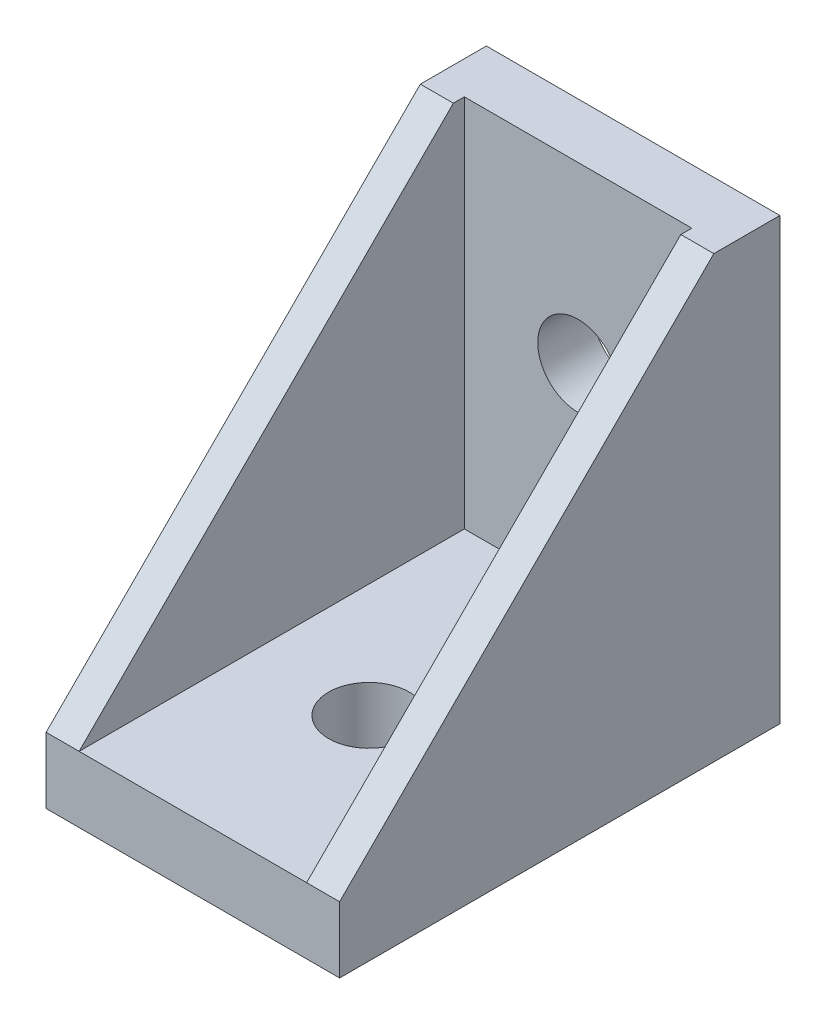
ISO-10303-21;
HEADER;
FILE_DESCRIPTION(('STEP AP214'),'2;1');
FILE_NAME('part.step','',(''),(''),'','','');
FILE_SCHEMA(('AUTOMOTIVE_DESIGN { 1 0 10303 214 1 1 1 1 }'));
ENDSEC;
DATA;
#1=APPLICATION_CONTEXT('core data for automotive mechanical design processes');
#2=APPLICATION_PROTOCOL_DEFINITION('international standard','automotive_design',2000,#1);
#3=PRODUCT_CONTEXT('',#1,'mechanical');
#4=PRODUCT('Part','Part','',(#3));
#5=PRODUCT_RELATED_PRODUCT_CATEGORY('part','',(#4));
#6=PRODUCT_DEFINITION_FORMATION('','',#4);
#7=PRODUCT_DEFINITION_CONTEXT('part definition',#1,'design');
#8=PRODUCT_DEFINITION('design','',#6,#7);
#9=PRODUCT_DEFINITION_SHAPE('','',#8);
#10=(LENGTH_UNIT() NAMED_UNIT(*) SI_UNIT(.MILLI.,.METRE.));
#11=(NAMED_UNIT(*) PLANE_ANGLE_UNIT() SI_UNIT($,.RADIAN.));
#12=(NAMED_UNIT(*) SI_UNIT($,.STERADIAN.) SOLID_ANGLE_UNIT());
#13=UNCERTAINTY_MEASURE_WITH_UNIT(LENGTH_MEASURE(1.E-05),#10,'distance_accuracy_value','');
#14=(GEOMETRIC_REPRESENTATION_CONTEXT(3) GLOBAL_UNCERTAINTY_ASSIGNED_CONTEXT((#13)) GLOBAL_UNIT_ASSIGNED_CONTEXT((#10,
#11,#12)) REPRESENTATION_CONTEXT('',''));
#15=CARTESIAN_POINT('',(0.,0.,0.));
#16=DIRECTION('',(0.,0.,1.));
#17=DIRECTION('',(1.,0.,0.));
#18=AXIS2_PLACEMENT_3D('',#15,#16,#17);
#19=CARTESIAN_POINT('',(10.,30.,-15.));
#20=DIRECTION('',(0.,-1.,0.));
#21=DIRECTION('',(0.,0.,-1.));
#22=AXIS2_PLACEMENT_3D('',#19,#20,#21);
#23=PLANE('',#22);
#24=DIRECTION('',(0.,0.,1.));
#25=VECTOR('',#24,1.);
#26=CARTESIAN_POINT('',(-7.75,30.,-11.25));
#27=LINE('',#26,#25);
#28=CARTESIAN_POINT('',(-7.75,30.,-11.25));
#29=VERTEX_POINT('',#28);
#30=CARTESIAN_POINT('',(-7.75,30.,-10.5));
#31=VERTEX_POINT('',#30);
#32=EDGE_CURVE('E225',#29,#31,#27,.T.);
#33=ORIENTED_EDGE('',*,*,#32,.F.);
#34=DIRECTION('',(1.,0.,0.));
#35=VECTOR('',#34,1.);
#36=CARTESIAN_POINT('',(-7.75,30.,-11.25));
#37=LINE('',#36,#35);
#38=CARTESIAN_POINT('',(7.75,30.,-11.25));
#39=VERTEX_POINT('',#38);
#40=EDGE_CURVE('E196',#29,#39,#37,.T.);
#41=ORIENTED_EDGE('',*,*,#40,.T.);
#42=DIRECTION('',(0.,0.,1.));
#43=VECTOR('',#42,1.);
#44=CARTESIAN_POINT('',(7.75,30.,-11.25));
#45=LINE('',#44,#43);
#46=CARTESIAN_POINT('',(7.75,30.,-10.5));
#47=VERTEX_POINT('',#46);
#48=EDGE_CURVE('E218',#39,#47,#45,.T.);
#49=ORIENTED_EDGE('',*,*,#48,.T.);
#50=DIRECTION('',(-1.,0.,0.));
#51=VECTOR('',#50,1.);
#52=CARTESIAN_POINT('',(10.,30.,-10.5));
#53=LINE('',#52,#51);
#54=CARTESIAN_POINT('',(10.,30.,-10.5));
#55=VERTEX_POINT('',#54);
#56=EDGE_CURVE('E50',#55,#47,#53,.T.);
#57=ORIENTED_EDGE('',*,*,#56,.F.);
#58=DIRECTION('',(0.,0.,1.));
#59=VECTOR('',#58,1.);
#60=CARTESIAN_POINT('',(10.,30.,-15.));
#61=LINE('',#60,#59);
#62=CARTESIAN_POINT('',(10.,30.,-15.));
#63=VERTEX_POINT('',#62);
#64=EDGE_CURVE('E108',#63,#55,#61,.T.);
#65=ORIENTED_EDGE('',*,*,#64,.F.);
#66=DIRECTION('',(-1.,0.,0.));
#67=VECTOR('',#66,1.);
#68=CARTESIAN_POINT('',(10.,30.,-15.));
#69=LINE('',#68,#67);
#70=CARTESIAN_POINT('',(-10.,30.,-15.));
#71=VERTEX_POINT('',#70);
#72=EDGE_CURVE('E11',#63,#71,#69,.T.);
#73=ORIENTED_EDGE('',*,*,#72,.T.);
#74=DIRECTION('',(0.,0.,1.));
#75=VECTOR('',#74,1.);
#76=CARTESIAN_POINT('',(-10.,30.,-15.));
#77=LINE('',#76,#75);
#78=CARTESIAN_POINT('',(-10.,30.,-10.5));
#79=VERTEX_POINT('',#78);
#80=EDGE_CURVE('E154',#71,#79,#77,.T.);
#81=ORIENTED_EDGE('',*,*,#80,.T.);
#82=EDGE_CURVE('E137',#31,#79,#53,.T.);
#83=ORIENTED_EDGE('',*,*,#82,.F.);
#84=EDGE_LOOP('',(#33,#41,#49,#57,#65,#73,#81,#83));
#85=FACE_BOUND('',#84,.T.);
#86=ADVANCED_FACE('F41',(#85),#23,.F.);
#87=CARTESIAN_POINT('',(10.,4.5,15.));
#88=DIRECTION('',(0.,-0.707106781186547,-0.707106781186548));
#89=DIRECTION('',(0.,0.707106781186548,-0.707106781186547));
#90=AXIS2_PLACEMENT_3D('',#87,#88,#89);
#91=PLANE('',#90);
#92=DIRECTION('',(0.,-0.707106781186548,0.707106781186547));
#93=VECTOR('',#92,1.);
#94=CARTESIAN_POINT('',(-7.75,30.,-10.5));
#95=LINE('',#94,#93);
#96=CARTESIAN_POINT('',(-7.75,4.5,15.));
#97=VERTEX_POINT('',#96);
#98=EDGE_CURVE('E60',#31,#97,#95,.T.);
#99=ORIENTED_EDGE('',*,*,#98,.F.);
#100=ORIENTED_EDGE('',*,*,#82,.T.);
#101=DIRECTION('',(0.,-0.707106781186548,0.707106781186547));
#102=VECTOR('',#101,1.);
#103=CARTESIAN_POINT('',(-10.,4.5,15.));
#104=LINE('',#103,#102);
#105=CARTESIAN_POINT('',(-10.,4.5,15.));
#106=VERTEX_POINT('',#105);
#107=EDGE_CURVE('E159',#79,#106,#104,.T.);
#108=ORIENTED_EDGE('',*,*,#107,.T.);
#109=DIRECTION('',(-1.,0.,0.));
#110=VECTOR('',#109,1.);
#111=CARTESIAN_POINT('',(10.,4.5,15.));
#112=LINE('',#111,#110);
#113=EDGE_CURVE('E138',#97,#106,#112,.T.);
#114=ORIENTED_EDGE('',*,*,#113,.F.);
#115=EDGE_LOOP('',(#99,#100,#108,#114));
#116=FACE_BOUND('',#115,.T.);
#117=ADVANCED_FACE('F178',(#116),#91,.F.);
#118=CARTESIAN_POINT('',(10.,0.,-15.));
#119=DIRECTION('',(0.,0.,1.));
#120=DIRECTION('',(0.,-1.,0.));
#121=AXIS2_PLACEMENT_3D('',#118,#119,#120);
#122=PLANE('',#121);
#123=CARTESIAN_POINT('',(0.,18.,-15.));
#124=DIRECTION('',(0.,0.,1.));
#125=DIRECTION('',(0.,-1.,0.));
#126=AXIS2_PLACEMENT_3D('',#123,#124,#125);
#127=CIRCLE('',#126,2.75);
#128=CARTESIAN_POINT('',(0.,15.25,-15.));
#129=VERTEX_POINT('',#128);
#130=EDGE_CURVE('E221',#129,#129,#127,.T.);
#131=ORIENTED_EDGE('',*,*,#130,.T.);
#132=EDGE_LOOP('',(#131));
#133=FACE_BOUND('',#132,.T.);
#134=DIRECTION('',(0.,1.,0.));
#135=VECTOR('',#134,1.);
#136=CARTESIAN_POINT('',(-10.,0.,-15.));
#137=LINE('',#136,#135);
#138=CARTESIAN_POINT('',(-10.,0.,-15.));
#139=VERTEX_POINT('',#138);
#140=EDGE_CURVE('E150',#139,#71,#137,.T.);
#141=ORIENTED_EDGE('',*,*,#140,.T.);
#142=ORIENTED_EDGE('',*,*,#72,.F.);
#143=DIRECTION('',(0.,1.,0.));
#144=VECTOR('',#143,1.);
#145=CARTESIAN_POINT('',(10.,0.,-15.));
#146=LINE('',#145,#144);
#147=CARTESIAN_POINT('',(10.,0.,-15.));
#148=VERTEX_POINT('',#147);
#149=EDGE_CURVE('E168',#148,#63,#146,.T.);
#150=ORIENTED_EDGE('',*,*,#149,.F.);
#151=DIRECTION('',(-1.,0.,0.));
#152=VECTOR('',#151,1.);
#153=CARTESIAN_POINT('',(10.,0.,-15.));
#154=LINE('',#153,#152);
#155=EDGE_CURVE('E146',#148,#139,#154,.T.);
#156=ORIENTED_EDGE('',*,*,#155,.T.);
#157=EDGE_LOOP('',(#141,#142,#150,#156));
#158=FACE_BOUND('',#157,.T.);
#159=ADVANCED_FACE('F43',(#133,#158),#122,.F.);
#160=ORIENTED_EDGE('',*,*,#56,.T.);
#161=DIRECTION('',(0.,-0.707106781186548,0.707106781186547));
#162=VECTOR('',#161,1.);
#163=CARTESIAN_POINT('',(7.75,30.,-10.5));
#164=LINE('',#163,#162);
#165=CARTESIAN_POINT('',(7.75,4.5,15.));
#166=VERTEX_POINT('',#165);
#167=EDGE_CURVE('E133',#47,#166,#164,.T.);
#168=ORIENTED_EDGE('',*,*,#167,.T.);
#169=CARTESIAN_POINT('',(10.,4.5,15.));
#170=VERTEX_POINT('',#169);
#171=EDGE_CURVE('E129',#170,#166,#112,.T.);
#172=ORIENTED_EDGE('',*,*,#171,.F.);
#173=DIRECTION('',(0.,-0.707106781186548,0.707106781186547));
#174=VECTOR('',#173,1.);
#175=CARTESIAN_POINT('',(10.,4.5,15.));
#176=LINE('',#175,#174);
#177=EDGE_CURVE('E117',#55,#170,#176,.T.);
#178=ORIENTED_EDGE('',*,*,#177,.F.);
#179=EDGE_LOOP('',(#160,#168,#172,#178));
#180=FACE_BOUND('',#179,.T.);
#181=ADVANCED_FACE('F130',(#180),#91,.F.);
#182=CARTESIAN_POINT('',(10.,0.,15.));
#183=DIRECTION('',(0.,0.,-1.));
#184=DIRECTION('',(0.,1.,0.));
#185=AXIS2_PLACEMENT_3D('',#182,#183,#184);
#186=PLANE('',#185);
#187=DIRECTION('',(0.,-1.,0.));
#188=VECTOR('',#187,1.);
#189=CARTESIAN_POINT('',(-10.,0.,15.));
#190=LINE('',#189,#188);
#191=CARTESIAN_POINT('',(-10.,0.,15.));
#192=VERTEX_POINT('',#191);
#193=EDGE_CURVE('E163',#106,#192,#190,.T.);
#194=ORIENTED_EDGE('',*,*,#193,.T.);
#195=DIRECTION('',(-1.,0.,0.));
#196=VECTOR('',#195,1.);
#197=CARTESIAN_POINT('',(10.,0.,15.));
#198=LINE('',#197,#196);
#199=CARTESIAN_POINT('',(10.,0.,15.));
#200=VERTEX_POINT('',#199);
#201=EDGE_CURVE('E141',#200,#192,#198,.T.);
#202=ORIENTED_EDGE('',*,*,#201,.F.);
#203=DIRECTION('',(0.,-1.,0.));
#204=VECTOR('',#203,1.);
#205=CARTESIAN_POINT('',(10.,0.,15.));
#206=LINE('',#205,#204);
#207=EDGE_CURVE('E121',#170,#200,#206,.T.);
#208=ORIENTED_EDGE('',*,*,#207,.F.);
#209=ORIENTED_EDGE('',*,*,#171,.T.);
#210=DIRECTION('',(1.,0.,0.));
#211=VECTOR('',#210,1.);
#212=CARTESIAN_POINT('',(-7.75,4.5,15.));
#213=LINE('',#212,#211);
#214=EDGE_CURVE('E200',#97,#166,#213,.T.);
#215=ORIENTED_EDGE('',*,*,#214,.F.);
#216=ORIENTED_EDGE('',*,*,#113,.T.);
#217=EDGE_LOOP('',(#194,#202,#208,#209,#215,#216));
#218=FACE_BOUND('',#217,.T.);
#219=ADVANCED_FACE('F140',(#218),#186,.F.);
#220=CARTESIAN_POINT('',(10.,0.,15.));
#221=DIRECTION('',(0.,1.,0.));
#222=DIRECTION('',(0.,0.,1.));
#223=AXIS2_PLACEMENT_3D('',#220,#221,#222);
#224=PLANE('',#223);
#225=CARTESIAN_POINT('',(0.,0.,3.00000000000001));
#226=DIRECTION('',(0.,1.,0.));
#227=DIRECTION('',(0.,0.,1.));
#228=AXIS2_PLACEMENT_3D('',#225,#226,#227);
#229=CIRCLE('',#228,2.75);
#230=CARTESIAN_POINT('',(0.,0.,5.75000000000001));
#231=VERTEX_POINT('',#230);
#232=EDGE_CURVE('E237',#231,#231,#229,.T.);
#233=ORIENTED_EDGE('',*,*,#232,.T.);
#234=EDGE_LOOP('',(#233));
#235=FACE_BOUND('',#234,.T.);
#236=DIRECTION('',(0.,0.,-1.));
#237=VECTOR('',#236,1.);
#238=CARTESIAN_POINT('',(-10.,0.,15.));
#239=LINE('',#238,#237);
#240=EDGE_CURVE('E97',#192,#139,#239,.T.);
#241=ORIENTED_EDGE('',*,*,#240,.T.);
#242=ORIENTED_EDGE('',*,*,#155,.F.);
#243=DIRECTION('',(0.,0.,-1.));
#244=VECTOR('',#243,1.);
#245=CARTESIAN_POINT('',(10.,0.,15.));
#246=LINE('',#245,#244);
#247=EDGE_CURVE('E69',#200,#148,#246,.T.);
#248=ORIENTED_EDGE('',*,*,#247,.F.);
#249=ORIENTED_EDGE('',*,*,#201,.T.);
#250=EDGE_LOOP('',(#241,#242,#248,#249));
#251=FACE_BOUND('',#250,.T.);
#252=ADVANCED_FACE('F188',(#235,#251),#224,.F.);
#253=CARTESIAN_POINT('',(10.,0.,0.));
#254=DIRECTION('',(1.,0.,0.));
#255=DIRECTION('',(0.,0.,-1.));
#256=AXIS2_PLACEMENT_3D('',#253,#254,#255);
#257=PLANE('',#256);
#258=ORIENTED_EDGE('',*,*,#149,.T.);
#259=ORIENTED_EDGE('',*,*,#64,.T.);
#260=ORIENTED_EDGE('',*,*,#177,.T.);
#261=ORIENTED_EDGE('',*,*,#207,.T.);
#262=ORIENTED_EDGE('',*,*,#247,.T.);
#263=EDGE_LOOP('',(#258,#259,#260,#261,#262));
#264=FACE_BOUND('',#263,.T.);
#265=ADVANCED_FACE('F119',(#264),#257,.T.);
#266=CARTESIAN_POINT('',(-10.,0.,0.));
#267=DIRECTION('',(1.,0.,0.));
#268=DIRECTION('',(0.,0.,-1.));
#269=AXIS2_PLACEMENT_3D('',#266,#267,#268);
#270=PLANE('',#269);
#271=ORIENTED_EDGE('',*,*,#140,.F.);
#272=ORIENTED_EDGE('',*,*,#240,.F.);
#273=ORIENTED_EDGE('',*,*,#193,.F.);
#274=ORIENTED_EDGE('',*,*,#107,.F.);
#275=ORIENTED_EDGE('',*,*,#80,.F.);
#276=EDGE_LOOP('',(#271,#272,#273,#274,#275));
#277=FACE_BOUND('',#276,.T.);
#278=ADVANCED_FACE('F187',(#277),#270,.F.);
#279=CARTESIAN_POINT('',(-7.75,4.5,-11.25));
#280=DIRECTION('',(0.,0.,-1.));
#281=DIRECTION('',(-1.,0.,0.));
#282=AXIS2_PLACEMENT_3D('',#279,#280,#281);
#283=PLANE('',#282);
#284=CARTESIAN_POINT('',(0.,18.,-11.25));
#285=DIRECTION('',(0.,0.,1.));
#286=DIRECTION('',(1.,0.,0.));
#287=AXIS2_PLACEMENT_3D('',#284,#285,#286);
#288=CIRCLE('',#287,2.75);
#289=CARTESIAN_POINT('',(2.75000000000001,18.,-11.25));
#290=VERTEX_POINT('',#289);
#291=EDGE_CURVE('E233',#290,#290,#288,.T.);
#292=ORIENTED_EDGE('',*,*,#291,.F.);
#293=EDGE_LOOP('',(#292));
#294=FACE_BOUND('',#293,.T.);
#295=DIRECTION('',(0.,1.,0.));
#296=VECTOR('',#295,1.);
#297=CARTESIAN_POINT('',(7.75,4.5,-11.25));
#298=LINE('',#297,#296);
#299=CARTESIAN_POINT('',(7.75,4.5,-11.25));
#300=VERTEX_POINT('',#299);
#301=EDGE_CURVE('E208',#300,#39,#298,.T.);
#302=ORIENTED_EDGE('',*,*,#301,.T.);
#303=ORIENTED_EDGE('',*,*,#40,.F.);
#304=DIRECTION('',(0.,1.,0.));
#305=VECTOR('',#304,1.);
#306=CARTESIAN_POINT('',(-7.75,26.1293440486998,-11.25));
#307=LINE('',#306,#305);
#308=CARTESIAN_POINT('',(-7.75,4.5,-11.25));
#309=VERTEX_POINT('',#308);
#310=EDGE_CURVE('E211',#309,#29,#307,.T.);
#311=ORIENTED_EDGE('',*,*,#310,.F.);
#312=DIRECTION('',(1.,0.,0.));
#313=VECTOR('',#312,1.);
#314=CARTESIAN_POINT('',(-7.75,4.5,-11.25));
#315=LINE('',#314,#313);
#316=EDGE_CURVE('E155',#309,#300,#315,.T.);
#317=ORIENTED_EDGE('',*,*,#316,.T.);
#318=EDGE_LOOP('',(#302,#303,#311,#317));
#319=FACE_BOUND('',#318,.T.);
#320=ADVANCED_FACE('F253',(#294,#319),#283,.F.);
#321=CARTESIAN_POINT('',(-7.75,4.5,11.25));
#322=DIRECTION('',(0.,-1.,0.));
#323=DIRECTION('',(0.,0.,-1.));
#324=AXIS2_PLACEMENT_3D('',#321,#322,#323);
#325=PLANE('',#324);
#326=CARTESIAN_POINT('',(0.,4.5,3.00000000000001));
#327=DIRECTION('',(0.,1.,0.));
#328=DIRECTION('',(0.,0.,1.));
#329=AXIS2_PLACEMENT_3D('',#326,#327,#328);
#330=CIRCLE('',#329,2.75);
#331=CARTESIAN_POINT('',(0.,4.5,5.75000000000001));
#332=VERTEX_POINT('',#331);
#333=EDGE_CURVE('E241',#332,#332,#330,.T.);
#334=ORIENTED_EDGE('',*,*,#333,.F.);
#335=EDGE_LOOP('',(#334));
#336=FACE_BOUND('',#335,.T.);
#337=DIRECTION('',(0.,0.,-1.));
#338=VECTOR('',#337,1.);
#339=CARTESIAN_POINT('',(7.75,4.5,11.25));
#340=LINE('',#339,#338);
#341=EDGE_CURVE('E212',#166,#300,#340,.T.);
#342=ORIENTED_EDGE('',*,*,#341,.T.);
#343=ORIENTED_EDGE('',*,*,#316,.F.);
#344=DIRECTION('',(0.,0.,-1.));
#345=VECTOR('',#344,1.);
#346=CARTESIAN_POINT('',(-7.75,4.5,15.));
#347=LINE('',#346,#345);
#348=EDGE_CURVE('E201',#97,#309,#347,.T.);
#349=ORIENTED_EDGE('',*,*,#348,.F.);
#350=ORIENTED_EDGE('',*,*,#214,.T.);
#351=EDGE_LOOP('',(#342,#343,#349,#350));
#352=FACE_BOUND('',#351,.T.);
#353=ADVANCED_FACE('F249',(#336,#352),#325,.F.);
#354=CARTESIAN_POINT('',(-7.75,0.,0.));
#355=DIRECTION('',(1.,0.,0.));
#356=DIRECTION('',(0.,0.,-1.));
#357=AXIS2_PLACEMENT_3D('',#354,#355,#356);
#358=PLANE('',#357);
#359=ORIENTED_EDGE('',*,*,#310,.T.);
#360=ORIENTED_EDGE('',*,*,#32,.T.);
#361=ORIENTED_EDGE('',*,*,#98,.T.);
#362=ORIENTED_EDGE('',*,*,#348,.T.);
#363=EDGE_LOOP('',(#359,#360,#361,#362));
#364=FACE_BOUND('',#363,.T.);
#365=ADVANCED_FACE('F252',(#364),#358,.T.);
#366=CARTESIAN_POINT('',(7.75,0.,0.));
#367=DIRECTION('',(1.,0.,0.));
#368=DIRECTION('',(0.,0.,-1.));
#369=AXIS2_PLACEMENT_3D('',#366,#367,#368);
#370=PLANE('',#369);
#371=ORIENTED_EDGE('',*,*,#301,.F.);
#372=ORIENTED_EDGE('',*,*,#341,.F.);
#373=ORIENTED_EDGE('',*,*,#167,.F.);
#374=ORIENTED_EDGE('',*,*,#48,.F.);
#375=EDGE_LOOP('',(#371,#372,#373,#374));
#376=FACE_BOUND('',#375,.T.);
#377=ADVANCED_FACE('F262',(#376),#370,.F.);
#378=CARTESIAN_POINT('',(0.,18.,-26.75));
#379=DIRECTION('',(0.,0.,1.));
#380=DIRECTION('',(1.,0.,0.));
#381=AXIS2_PLACEMENT_3D('',#378,#379,#380);
#382=CYLINDRICAL_SURFACE('',#381,2.75);
#383=ORIENTED_EDGE('',*,*,#291,.T.);
#384=EDGE_LOOP('',(#383));
#385=FACE_BOUND('',#384,.T.);
#386=ORIENTED_EDGE('',*,*,#130,.F.);
#387=EDGE_LOOP('',(#386));
#388=FACE_BOUND('',#387,.T.);
#389=ADVANCED_FACE('F280',(#385,#388),#382,.F.);
#390=CARTESIAN_POINT('',(0.,-11.,3.00000000000001));
#391=DIRECTION('',(0.,1.,0.));
#392=DIRECTION('',(0.,0.,1.));
#393=AXIS2_PLACEMENT_3D('',#390,#391,#392);
#394=CYLINDRICAL_SURFACE('',#393,2.75);
#395=ORIENTED_EDGE('',*,*,#333,.T.);
#396=EDGE_LOOP('',(#395));
#397=FACE_BOUND('',#396,.T.);
#398=ORIENTED_EDGE('',*,*,#232,.F.);
#399=EDGE_LOOP('',(#398));
#400=FACE_BOUND('',#399,.T.);
#401=ADVANCED_FACE('F246',(#397,#400),#394,.F.);
#402=CLOSED_SHELL('',(#86,#117,#159,#181,#219,#252,#265,#278,#320,#353,#365,#377,#389,#401));
#403=MANIFOLD_SOLID_BREP('B2',#402);
#404=ADVANCED_BREP_SHAPE_REPRESENTATION('',(#18,#403),#14);
#405=SHAPE_DEFINITION_REPRESENTATION(#9,#404);
ENDSEC;
END-ISO-10303-21;
